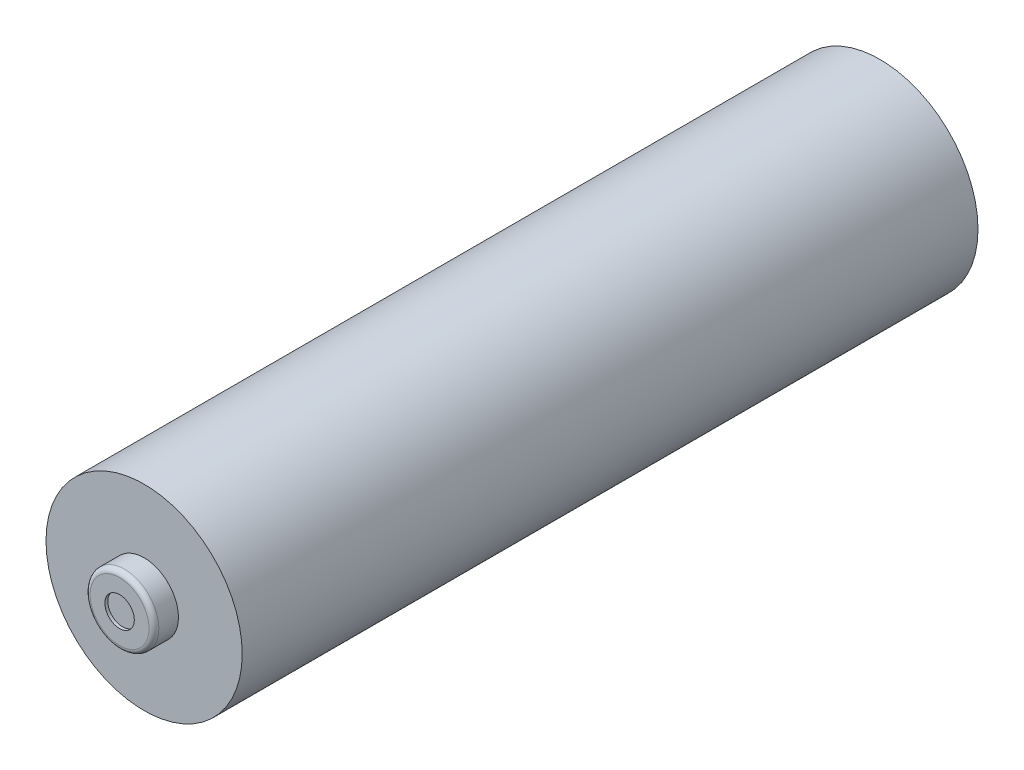
ISO-10303-21;
HEADER;
FILE_DESCRIPTION(('STEP AP214'),'2;1');
FILE_NAME('part.step','',(''),(''),'','','');
FILE_SCHEMA(('AUTOMOTIVE_DESIGN { 1 0 10303 214 1 1 1 1 }'));
ENDSEC;
DATA;
#1=APPLICATION_CONTEXT('core data for automotive mechanical design processes');
#2=APPLICATION_PROTOCOL_DEFINITION('international standard','automotive_design',2000,#1);
#3=PRODUCT_CONTEXT('',#1,'mechanical');
#4=PRODUCT('Part','Part','',(#3));
#5=PRODUCT_RELATED_PRODUCT_CATEGORY('part','',(#4));
#6=PRODUCT_DEFINITION_FORMATION('','',#4);
#7=PRODUCT_DEFINITION_CONTEXT('part definition',#1,'design');
#8=PRODUCT_DEFINITION('design','',#6,#7);
#9=PRODUCT_DEFINITION_SHAPE('','',#8);
#10=(LENGTH_UNIT() NAMED_UNIT(*) SI_UNIT(.MILLI.,.METRE.));
#11=(NAMED_UNIT(*) PLANE_ANGLE_UNIT() SI_UNIT($,.RADIAN.));
#12=(NAMED_UNIT(*) SI_UNIT($,.STERADIAN.) SOLID_ANGLE_UNIT());
#13=UNCERTAINTY_MEASURE_WITH_UNIT(LENGTH_MEASURE(1.E-05),#10,'distance_accuracy_value','');
#14=(GEOMETRIC_REPRESENTATION_CONTEXT(3) GLOBAL_UNCERTAINTY_ASSIGNED_CONTEXT((#13)) GLOBAL_UNIT_ASSIGNED_CONTEXT((#10,
#11,#12)) REPRESENTATION_CONTEXT('',''));
#15=CARTESIAN_POINT('',(0.,0.,0.));
#16=DIRECTION('',(0.,0.,1.));
#17=DIRECTION('',(1.,0.,0.));
#18=AXIS2_PLACEMENT_3D('',#15,#16,#17);
#19=CARTESIAN_POINT('',(0.,0.,1905.));
#20=DIRECTION('',(0.,0.,-1.));
#21=DIRECTION('',(-1.,0.,0.));
#22=AXIS2_PLACEMENT_3D('',#19,#20,#21);
#23=CYLINDRICAL_SURFACE('',#22,254.);
#24=CARTESIAN_POINT('',(0.,0.,1905.));
#25=DIRECTION('',(0.,0.,1.));
#26=DIRECTION('',(1.,0.,0.));
#27=AXIS2_PLACEMENT_3D('',#24,#25,#26);
#28=CIRCLE('',#27,254.);
#29=CARTESIAN_POINT('',(254.,0.,1905.));
#30=VERTEX_POINT('',#29);
#31=EDGE_CURVE('E81',#30,#30,#28,.T.);
#32=ORIENTED_EDGE('',*,*,#31,.F.);
#33=EDGE_LOOP('',(#32));
#34=FACE_BOUND('',#33,.T.);
#35=CARTESIAN_POINT('',(0.,0.,0.));
#36=DIRECTION('',(0.,0.,1.));
#37=DIRECTION('',(1.,0.,0.));
#38=AXIS2_PLACEMENT_3D('',#35,#36,#37);
#39=CIRCLE('',#38,254.);
#40=CARTESIAN_POINT('',(254.,0.,0.));
#41=VERTEX_POINT('',#40);
#42=EDGE_CURVE('E76',#41,#41,#39,.T.);
#43=ORIENTED_EDGE('',*,*,#42,.T.);
#44=EDGE_LOOP('',(#43));
#45=FACE_BOUND('',#44,.T.);
#46=ADVANCED_FACE('F47',(#34,#45),#23,.T.);
#47=CARTESIAN_POINT('',(0.,0.,1905.));
#48=DIRECTION('',(0.,0.,1.));
#49=DIRECTION('',(1.,0.,0.));
#50=AXIS2_PLACEMENT_3D('',#47,#48,#49);
#51=PLANE('',#50);
#52=CARTESIAN_POINT('',(0.,0.,1905.));
#53=DIRECTION('',(0.,0.,1.));
#54=DIRECTION('',(1.,0.,0.));
#55=AXIS2_PLACEMENT_3D('',#52,#53,#54);
#56=CIRCLE('',#55,88.9);
#57=CARTESIAN_POINT('',(88.9,0.,1905.));
#58=VERTEX_POINT('',#57);
#59=EDGE_CURVE('E71',#58,#58,#56,.T.);
#60=ORIENTED_EDGE('',*,*,#59,.F.);
#61=EDGE_LOOP('',(#60));
#62=FACE_BOUND('',#61,.T.);
#63=ORIENTED_EDGE('',*,*,#31,.T.);
#64=EDGE_LOOP('',(#63));
#65=FACE_BOUND('',#64,.T.);
#66=ADVANCED_FACE('F129',(#62,#65),#51,.T.);
#67=CARTESIAN_POINT('',(0.,0.,0.));
#68=DIRECTION('',(0.,0.,1.));
#69=DIRECTION('',(1.,0.,0.));
#70=AXIS2_PLACEMENT_3D('',#67,#68,#69);
#71=PLANE('',#70);
#72=CARTESIAN_POINT('',(0.,0.,0.));
#73=DIRECTION('',(0.,0.,1.));
#74=DIRECTION('',(1.,0.,0.));
#75=AXIS2_PLACEMENT_3D('',#72,#73,#74);
#76=CIRCLE('',#75,88.9);
#77=CARTESIAN_POINT('',(88.9,0.,0.));
#78=VERTEX_POINT('',#77);
#79=EDGE_CURVE('E72',#78,#78,#76,.T.);
#80=ORIENTED_EDGE('',*,*,#79,.T.);
#81=EDGE_LOOP('',(#80));
#82=FACE_BOUND('',#81,.T.);
#83=ORIENTED_EDGE('',*,*,#42,.F.);
#84=EDGE_LOOP('',(#83));
#85=FACE_BOUND('',#84,.T.);
#86=ADVANCED_FACE('F135',(#82,#85),#71,.F.);
#87=CARTESIAN_POINT('',(0.,0.,-63.5));
#88=DIRECTION('',(0.,0.,1.));
#89=DIRECTION('',(1.,0.,0.));
#90=AXIS2_PLACEMENT_3D('',#87,#88,#89);
#91=PLANE('',#90);
#92=CARTESIAN_POINT('',(0.,0.,-63.5));
#93=DIRECTION('',(0.,0.,-1.));
#94=DIRECTION('',(-1.,0.,0.));
#95=AXIS2_PLACEMENT_3D('',#92,#93,#94);
#96=CIRCLE('',#95,38.1);
#97=CARTESIAN_POINT('',(-38.1,0.,-63.5));
#98=VERTEX_POINT('',#97);
#99=EDGE_CURVE('E88',#98,#98,#96,.T.);
#100=ORIENTED_EDGE('',*,*,#99,.F.);
#101=EDGE_LOOP('',(#100));
#102=FACE_BOUND('',#101,.T.);
#103=CARTESIAN_POINT('',(0.,0.,-63.5));
#104=DIRECTION('',(0.,0.,1.));
#105=DIRECTION('',(1.,0.,0.));
#106=AXIS2_PLACEMENT_3D('',#103,#104,#105);
#107=CIRCLE('',#106,76.2);
#108=CARTESIAN_POINT('',(76.2,0.,-63.5));
#109=VERTEX_POINT('',#108);
#110=EDGE_CURVE('E65',#109,#109,#107,.F.);
#111=ORIENTED_EDGE('',*,*,#110,.T.);
#112=EDGE_LOOP('',(#111));
#113=FACE_BOUND('',#112,.T.);
#114=ADVANCED_FACE('F142',(#102,#113),#91,.F.);
#115=CARTESIAN_POINT('',(0.,0.,-378.447171389937));
#116=DIRECTION('',(0.,0.,1.));
#117=DIRECTION('',(1.,0.,0.));
#118=AXIS2_PLACEMENT_3D('',#115,#116,#117);
#119=CYLINDRICAL_SURFACE('',#118,88.9);
#120=CARTESIAN_POINT('',(0.,0.,-50.8));
#121=DIRECTION('',(0.,0.,1.));
#122=DIRECTION('',(1.,0.,0.));
#123=AXIS2_PLACEMENT_3D('',#120,#121,#122);
#124=CIRCLE('',#123,88.9);
#125=CARTESIAN_POINT('',(88.9,0.,-50.8));
#126=VERTEX_POINT('',#125);
#127=EDGE_CURVE('E60',#126,#126,#124,.T.);
#128=ORIENTED_EDGE('',*,*,#127,.T.);
#129=EDGE_LOOP('',(#128));
#130=FACE_BOUND('',#129,.T.);
#131=ORIENTED_EDGE('',*,*,#79,.F.);
#132=EDGE_LOOP('',(#131));
#133=FACE_BOUND('',#132,.T.);
#134=ADVANCED_FACE('F124',(#130,#133),#119,.T.);
#135=CARTESIAN_POINT('',(0.,0.,1955.8));
#136=DIRECTION('',(0.,0.,1.));
#137=DIRECTION('',(1.,0.,0.));
#138=AXIS2_PLACEMENT_3D('',#135,#136,#137);
#139=CIRCLE('',#138,88.9);
#140=CARTESIAN_POINT('',(88.9,0.,1955.8));
#141=VERTEX_POINT('',#140);
#142=EDGE_CURVE('E11',#141,#141,#139,.F.);
#143=ORIENTED_EDGE('',*,*,#142,.T.);
#144=EDGE_LOOP('',(#143));
#145=FACE_BOUND('',#144,.T.);
#146=ORIENTED_EDGE('',*,*,#59,.T.);
#147=EDGE_LOOP('',(#146));
#148=FACE_BOUND('',#147,.T.);
#149=ADVANCED_FACE('F116',(#145,#148),#119,.T.);
#150=CARTESIAN_POINT('',(0.,0.,1968.5));
#151=DIRECTION('',(0.,0.,1.));
#152=DIRECTION('',(1.,0.,0.));
#153=AXIS2_PLACEMENT_3D('',#150,#151,#152);
#154=PLANE('',#153);
#155=CARTESIAN_POINT('',(0.,0.,1968.5));
#156=DIRECTION('',(0.,0.,1.));
#157=DIRECTION('',(1.,0.,0.));
#158=AXIS2_PLACEMENT_3D('',#155,#156,#157);
#159=CIRCLE('',#158,38.1);
#160=CARTESIAN_POINT('',(38.1,0.,1968.5));
#161=VERTEX_POINT('',#160);
#162=EDGE_CURVE('E96',#161,#161,#159,.T.);
#163=ORIENTED_EDGE('',*,*,#162,.F.);
#164=EDGE_LOOP('',(#163));
#165=FACE_BOUND('',#164,.T.);
#166=CARTESIAN_POINT('',(0.,0.,1968.5));
#167=DIRECTION('',(0.,0.,1.));
#168=DIRECTION('',(1.,0.,0.));
#169=AXIS2_PLACEMENT_3D('',#166,#167,#168);
#170=CIRCLE('',#169,76.2);
#171=CARTESIAN_POINT('',(76.2,0.,1968.5));
#172=VERTEX_POINT('',#171);
#173=EDGE_CURVE('E55',#172,#172,#170,.T.);
#174=ORIENTED_EDGE('',*,*,#173,.T.);
#175=EDGE_LOOP('',(#174));
#176=FACE_BOUND('',#175,.T.);
#177=ADVANCED_FACE('F113',(#165,#176),#154,.T.);
#178=CARTESIAN_POINT('',(0.,0.,-50.8));
#179=DIRECTION('',(0.,0.,1.));
#180=DIRECTION('',(1.,0.,0.));
#181=AXIS2_PLACEMENT_3D('',#178,#179,#180);
#182=TOROIDAL_SURFACE('',#181,76.2,12.7);
#183=ORIENTED_EDGE('',*,*,#127,.F.);
#184=EDGE_LOOP('',(#183));
#185=FACE_BOUND('',#184,.T.);
#186=ORIENTED_EDGE('',*,*,#110,.F.);
#187=EDGE_LOOP('',(#186));
#188=FACE_BOUND('',#187,.T.);
#189=ADVANCED_FACE('F115',(#185,#188),#182,.T.);
#190=CARTESIAN_POINT('',(0.,0.,1955.8));
#191=DIRECTION('',(0.,0.,1.));
#192=DIRECTION('',(1.,0.,0.));
#193=AXIS2_PLACEMENT_3D('',#190,#191,#192);
#194=TOROIDAL_SURFACE('',#193,76.2,12.7);
#195=ORIENTED_EDGE('',*,*,#142,.F.);
#196=EDGE_LOOP('',(#195));
#197=FACE_BOUND('',#196,.T.);
#198=ORIENTED_EDGE('',*,*,#173,.F.);
#199=EDGE_LOOP('',(#198));
#200=FACE_BOUND('',#199,.T.);
#201=ADVANCED_FACE('F49',(#197,#200),#194,.T.);
#202=CARTESIAN_POINT('',(0.,0.,-55.88));
#203=DIRECTION('',(0.,0.,-1.));
#204=DIRECTION('',(-1.,0.,0.));
#205=AXIS2_PLACEMENT_3D('',#202,#203,#204);
#206=CYLINDRICAL_SURFACE('',#205,38.1);
#207=CARTESIAN_POINT('',(0.,0.,-55.88));
#208=DIRECTION('',(0.,0.,-1.));
#209=DIRECTION('',(-1.,0.,0.));
#210=AXIS2_PLACEMENT_3D('',#207,#208,#209);
#211=CIRCLE('',#210,38.1);
#212=CARTESIAN_POINT('',(-38.1,0.,-55.88));
#213=VERTEX_POINT('',#212);
#214=EDGE_CURVE('E77',#213,#213,#211,.T.);
#215=CARTESIAN_POINT('',(-38.1,0.,-55.88));
#216=CARTESIAN_POINT('',(-38.1,0.,-55.959375));
#217=CARTESIAN_POINT('',(-38.1,0.,-56.03875));
#218=CARTESIAN_POINT('',(-38.1,0.,-56.1975));
#219=CARTESIAN_POINT('',(-38.1,0.,-56.276875));
#220=CARTESIAN_POINT('',(-38.1,0.,-56.435625));
#221=CARTESIAN_POINT('',(-38.1,0.,-56.515));
#222=CARTESIAN_POINT('',(-38.1,0.,-56.67375));
#223=CARTESIAN_POINT('',(-38.1,0.,-56.753125));
#224=CARTESIAN_POINT('',(-38.1,0.,-56.911875));
#225=CARTESIAN_POINT('',(-38.1,0.,-56.99125));
#226=CARTESIAN_POINT('',(-38.1,0.,-57.15));
#227=CARTESIAN_POINT('',(-38.1,0.,-57.229375));
#228=CARTESIAN_POINT('',(-38.1,0.,-57.388125));
#229=CARTESIAN_POINT('',(-38.1,0.,-57.4675));
#230=CARTESIAN_POINT('',(-38.1,0.,-57.62625));
#231=CARTESIAN_POINT('',(-38.1,0.,-57.705625));
#232=CARTESIAN_POINT('',(-38.1,0.,-57.864375));
#233=CARTESIAN_POINT('',(-38.1,0.,-57.94375));
#234=CARTESIAN_POINT('',(-38.1,0.,-58.1025));
#235=CARTESIAN_POINT('',(-38.1,0.,-58.181875));
#236=CARTESIAN_POINT('',(-38.1,0.,-58.340625));
#237=CARTESIAN_POINT('',(-38.1,0.,-58.42));
#238=CARTESIAN_POINT('',(-38.1,0.,-58.57875));
#239=CARTESIAN_POINT('',(-38.1,0.,-58.658125));
#240=CARTESIAN_POINT('',(-38.1,0.,-58.816875));
#241=CARTESIAN_POINT('',(-38.1,0.,-58.89625));
#242=CARTESIAN_POINT('',(-38.1,0.,-59.055));
#243=CARTESIAN_POINT('',(-38.1,0.,-59.134375));
#244=CARTESIAN_POINT('',(-38.1,0.,-59.293125));
#245=CARTESIAN_POINT('',(-38.1,0.,-59.3725));
#246=CARTESIAN_POINT('',(-38.1,0.,-59.53125));
#247=CARTESIAN_POINT('',(-38.1,0.,-59.610625));
#248=CARTESIAN_POINT('',(-38.1,0.,-59.769375));
#249=CARTESIAN_POINT('',(-38.1,0.,-59.84875));
#250=CARTESIAN_POINT('',(-38.1,0.,-60.0075));
#251=CARTESIAN_POINT('',(-38.1,0.,-60.086875));
#252=CARTESIAN_POINT('',(-38.1,0.,-60.245625));
#253=CARTESIAN_POINT('',(-38.1,0.,-60.325));
#254=CARTESIAN_POINT('',(-38.1,0.,-60.48375));
#255=CARTESIAN_POINT('',(-38.1,0.,-60.563125));
#256=CARTESIAN_POINT('',(-38.1,0.,-60.721875));
#257=CARTESIAN_POINT('',(-38.1,0.,-60.80125));
#258=CARTESIAN_POINT('',(-38.1,0.,-60.96));
#259=CARTESIAN_POINT('',(-38.1,0.,-61.039375));
#260=CARTESIAN_POINT('',(-38.1,0.,-61.198125));
#261=CARTESIAN_POINT('',(-38.1,0.,-61.2775));
#262=CARTESIAN_POINT('',(-38.1,0.,-61.43625));
#263=CARTESIAN_POINT('',(-38.1,0.,-61.515625));
#264=CARTESIAN_POINT('',(-38.1,0.,-61.674375));
#265=CARTESIAN_POINT('',(-38.1,0.,-61.75375));
#266=CARTESIAN_POINT('',(-38.1,0.,-61.9125));
#267=CARTESIAN_POINT('',(-38.1,0.,-61.991875));
#268=CARTESIAN_POINT('',(-38.1,0.,-62.150625));
#269=CARTESIAN_POINT('',(-38.1,0.,-62.23));
#270=CARTESIAN_POINT('',(-38.1,0.,-62.38875));
#271=CARTESIAN_POINT('',(-38.1,0.,-62.468125));
#272=CARTESIAN_POINT('',(-38.1,0.,-62.626875));
#273=CARTESIAN_POINT('',(-38.1,0.,-62.70625));
#274=CARTESIAN_POINT('',(-38.1,0.,-62.865));
#275=CARTESIAN_POINT('',(-38.1,0.,-62.944375));
#276=CARTESIAN_POINT('',(-38.1,0.,-63.103125));
#277=CARTESIAN_POINT('',(-38.1,0.,-63.1825));
#278=CARTESIAN_POINT('',(-38.1,0.,-63.34125));
#279=CARTESIAN_POINT('',(-38.1,0.,-63.420625));
#280=CARTESIAN_POINT('',(-38.1,0.,-63.5));
#281=B_SPLINE_CURVE_WITH_KNOTS('',3,(#215,#216,#217,#218,#219,#220,#221,#222,#223,#224,#225,
#226,#227,#228,#229,#230,#231,#232,#233,#234,#235,#236,#237,#238,#239,#240,#241,#242,#243,#244,
#245,#246,#247,#248,#249,#250,#251,#252,#253,#254,#255,#256,#257,#258,#259,#260,#261,#262,#263,
#264,#265,#266,#267,#268,#269,#270,#271,#272,#273,#274,#275,#276,#277,#278,#279,#280),
.UNSPECIFIED.,.F.,.F.,(4,2,2,2,2,2,2,2,2,2,2,2,2,2,2,2,2,2,2,2,2,2,2,2,2,2,2,2,2,2,2,2,4),(0.,
0.238125000000006,0.476250000000004,0.714375000000003,0.952500000000002,1.190625,1.42875,
1.66687500000001,1.905,2.143125,2.38125,2.619375,2.85750000000001,3.095625,3.33375,3.571875,
3.81,4.048125,4.28625,4.524375,4.7625,5.000625,5.23875,5.476875,5.71500000000001,5.953125,
6.19125,6.429375,6.6675,6.90562500000001,7.14375,7.381875,7.61999999999999),.UNSPECIFIED.);
#282=EDGE_CURVE('BSEAM157',#213,#98,#281,.T.);
#283=ORIENTED_EDGE('',*,*,#214,.F.);
#284=ORIENTED_EDGE('',*,*,#99,.T.);
#285=ORIENTED_EDGE('',*,*,#282,.T.);
#286=ORIENTED_EDGE('',*,*,#282,.F.);
#287=EDGE_LOOP('',(#283,#285,#284,#286));
#288=FACE_BOUND('',#287,.T.);
#289=ADVANCED_FACE('F157',(#288),#206,.F.);
#290=CARTESIAN_POINT('',(0.,0.,-55.88));
#291=DIRECTION('',(0.,0.,-1.));
#292=DIRECTION('',(-1.,0.,0.));
#293=AXIS2_PLACEMENT_3D('',#290,#291,#292);
#294=PLANE('',#293);
#295=ORIENTED_EDGE('',*,*,#214,.T.);
#296=EDGE_LOOP('',(#295));
#297=FACE_BOUND('',#296,.T.);
#298=ADVANCED_FACE('F109',(#297),#294,.T.);
#299=CARTESIAN_POINT('',(0.,0.,1960.88));
#300=DIRECTION('',(0.,0.,1.));
#301=DIRECTION('',(1.,0.,0.));
#302=AXIS2_PLACEMENT_3D('',#299,#300,#301);
#303=CYLINDRICAL_SURFACE('',#302,38.1);
#304=CARTESIAN_POINT('',(0.,0.,1960.88));
#305=DIRECTION('',(0.,0.,1.));
#306=DIRECTION('',(1.,0.,0.));
#307=AXIS2_PLACEMENT_3D('',#304,#305,#306);
#308=CIRCLE('',#307,38.1);
#309=CARTESIAN_POINT('',(38.1,0.,1960.88));
#310=VERTEX_POINT('',#309);
#311=EDGE_CURVE('E92',#310,#310,#308,.T.);
#312=CARTESIAN_POINT('',(38.1,0.,1960.88));
#313=CARTESIAN_POINT('',(38.1,0.,1960.959375));
#314=CARTESIAN_POINT('',(38.1,0.,1961.03875));
#315=CARTESIAN_POINT('',(38.1,0.,1961.1975));
#316=CARTESIAN_POINT('',(38.1,0.,1961.276875));
#317=CARTESIAN_POINT('',(38.1,0.,1961.435625));
#318=CARTESIAN_POINT('',(38.1,0.,1961.515));
#319=CARTESIAN_POINT('',(38.1,0.,1961.67375));
#320=CARTESIAN_POINT('',(38.1,0.,1961.753125));
#321=CARTESIAN_POINT('',(38.1,0.,1961.911875));
#322=CARTESIAN_POINT('',(38.1,0.,1961.99125));
#323=CARTESIAN_POINT('',(38.1,0.,1962.15));
#324=CARTESIAN_POINT('',(38.1,0.,1962.229375));
#325=CARTESIAN_POINT('',(38.1,0.,1962.388125));
#326=CARTESIAN_POINT('',(38.1,0.,1962.4675));
#327=CARTESIAN_POINT('',(38.1,0.,1962.62625));
#328=CARTESIAN_POINT('',(38.1,0.,1962.705625));
#329=CARTESIAN_POINT('',(38.1,0.,1962.864375));
#330=CARTESIAN_POINT('',(38.1,0.,1962.94375));
#331=CARTESIAN_POINT('',(38.1,0.,1963.1025));
#332=CARTESIAN_POINT('',(38.1,0.,1963.181875));
#333=CARTESIAN_POINT('',(38.1,0.,1963.340625));
#334=CARTESIAN_POINT('',(38.1,0.,1963.42));
#335=CARTESIAN_POINT('',(38.1,0.,1963.57875));
#336=CARTESIAN_POINT('',(38.1,0.,1963.658125));
#337=CARTESIAN_POINT('',(38.1,0.,1963.816875));
#338=CARTESIAN_POINT('',(38.1,0.,1963.89625));
#339=CARTESIAN_POINT('',(38.1,0.,1964.055));
#340=CARTESIAN_POINT('',(38.1,0.,1964.134375));
#341=CARTESIAN_POINT('',(38.1,0.,1964.293125));
#342=CARTESIAN_POINT('',(38.1,0.,1964.3725));
#343=CARTESIAN_POINT('',(38.1,0.,1964.53125));
#344=CARTESIAN_POINT('',(38.1,0.,1964.610625));
#345=CARTESIAN_POINT('',(38.1,0.,1964.769375));
#346=CARTESIAN_POINT('',(38.1,0.,1964.84875));
#347=CARTESIAN_POINT('',(38.1,0.,1965.0075));
#348=CARTESIAN_POINT('',(38.1,0.,1965.086875));
#349=CARTESIAN_POINT('',(38.1,0.,1965.245625));
#350=CARTESIAN_POINT('',(38.1,0.,1965.325));
#351=CARTESIAN_POINT('',(38.1,0.,1965.48375));
#352=CARTESIAN_POINT('',(38.1,0.,1965.563125));
#353=CARTESIAN_POINT('',(38.1,0.,1965.721875));
#354=CARTESIAN_POINT('',(38.1,0.,1965.80125));
#355=CARTESIAN_POINT('',(38.1,0.,1965.96));
#356=CARTESIAN_POINT('',(38.1,0.,1966.039375));
#357=CARTESIAN_POINT('',(38.1,0.,1966.198125));
#358=CARTESIAN_POINT('',(38.1,0.,1966.2775));
#359=CARTESIAN_POINT('',(38.1,0.,1966.43625));
#360=CARTESIAN_POINT('',(38.1,0.,1966.515625));
#361=CARTESIAN_POINT('',(38.1,0.,1966.674375));
#362=CARTESIAN_POINT('',(38.1,0.,1966.75375));
#363=CARTESIAN_POINT('',(38.1,0.,1966.9125));
#364=CARTESIAN_POINT('',(38.1,0.,1966.991875));
#365=CARTESIAN_POINT('',(38.1,0.,1967.150625));
#366=CARTESIAN_POINT('',(38.1,0.,1967.23));
#367=CARTESIAN_POINT('',(38.1,0.,1967.38875));
#368=CARTESIAN_POINT('',(38.1,0.,1967.468125));
#369=CARTESIAN_POINT('',(38.1,0.,1967.626875));
#370=CARTESIAN_POINT('',(38.1,0.,1967.70625));
#371=CARTESIAN_POINT('',(38.1,0.,1967.865));
#372=CARTESIAN_POINT('',(38.1,0.,1967.944375));
#373=CARTESIAN_POINT('',(38.1,0.,1968.103125));
#374=CARTESIAN_POINT('',(38.1,0.,1968.1825));
#375=CARTESIAN_POINT('',(38.1,0.,1968.34125));
#376=CARTESIAN_POINT('',(38.1,0.,1968.420625));
#377=CARTESIAN_POINT('',(38.1,0.,1968.5));
#378=B_SPLINE_CURVE_WITH_KNOTS('',3,(#312,#313,#314,#315,#316,#317,#318,#319,#320,#321,#322,
#323,#324,#325,#326,#327,#328,#329,#330,#331,#332,#333,#334,#335,#336,#337,#338,#339,#340,#341,
#342,#343,#344,#345,#346,#347,#348,#349,#350,#351,#352,#353,#354,#355,#356,#357,#358,#359,#360,
#361,#362,#363,#364,#365,#366,#367,#368,#369,#370,#371,#372,#373,#374,#375,#376,#377),
.UNSPECIFIED.,.F.,.F.,(4,2,2,2,2,2,2,2,2,2,2,2,2,2,2,2,2,2,2,2,2,2,2,2,2,2,2,2,2,2,2,2,4),(0.,
0.238125000000089,0.476250000000178,0.714375000000045,0.952500000000134,1.190625,
1.42875000000009,1.66687500000018,1.90500000000005,2.14312500000013,2.38125,2.61937500000009,
2.85750000000018,3.09562500000005,3.33375000000014,3.571875,3.81000000000009,4.04812500000018,
4.28625000000005,4.52437500000014,4.7625,5.00062500000009,5.23875000000018,5.47687500000005,
5.71500000000014,5.953125,6.19125000000009,6.42937500000018,6.66750000000005,6.90562500000014,
7.14375,7.38187500000009,7.61999999999996),.UNSPECIFIED.);
#379=EDGE_CURVE('BSEAM106',#310,#161,#378,.T.);
#380=ORIENTED_EDGE('',*,*,#311,.F.);
#381=ORIENTED_EDGE('',*,*,#162,.T.);
#382=ORIENTED_EDGE('',*,*,#379,.T.);
#383=ORIENTED_EDGE('',*,*,#379,.F.);
#384=EDGE_LOOP('',(#380,#382,#381,#383));
#385=FACE_BOUND('',#384,.T.);
#386=ADVANCED_FACE('F106',(#385),#303,.F.);
#387=CARTESIAN_POINT('',(0.,0.,1960.88));
#388=DIRECTION('',(0.,0.,1.));
#389=DIRECTION('',(1.,0.,0.));
#390=AXIS2_PLACEMENT_3D('',#387,#388,#389);
#391=PLANE('',#390);
#392=ORIENTED_EDGE('',*,*,#311,.T.);
#393=EDGE_LOOP('',(#392));
#394=FACE_BOUND('',#393,.T.);
#395=ADVANCED_FACE('F104',(#394),#391,.T.);
#396=CLOSED_SHELL('',(#46,#66,#86,#114,#134,#149,#177,#189,#201,#289,#298,#386,#395));
#397=MANIFOLD_SOLID_BREP('B2',#396);
#398=ADVANCED_BREP_SHAPE_REPRESENTATION('',(#18,#397),#14);
#399=SHAPE_DEFINITION_REPRESENTATION(#9,#398);
ENDSEC;
END-ISO-10303-21;
